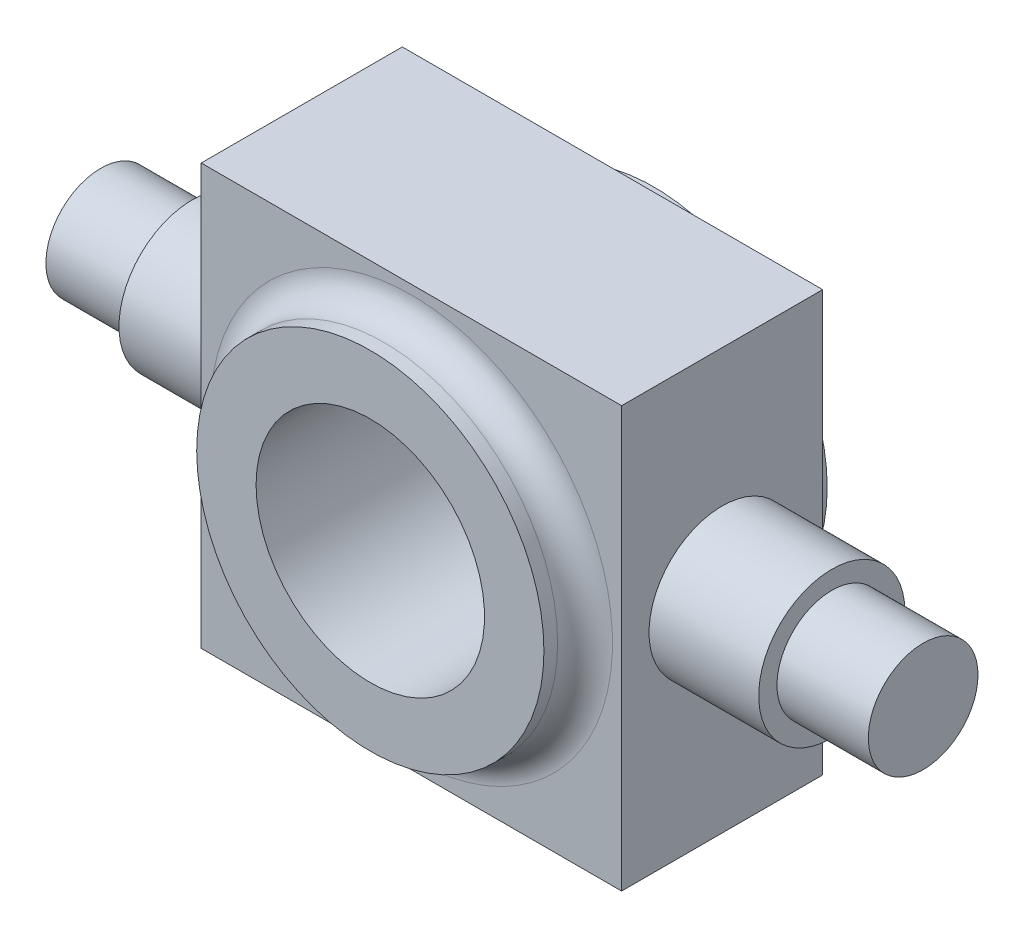
ISO-10303-21;
HEADER;
FILE_DESCRIPTION(('STEP AP214'),'2;1');
FILE_NAME('part.step','',(''),(''),'','','');
FILE_SCHEMA(('AUTOMOTIVE_DESIGN { 1 0 10303 214 1 1 1 1 }'));
ENDSEC;
DATA;
#1=APPLICATION_CONTEXT('core data for automotive mechanical design processes');
#2=APPLICATION_PROTOCOL_DEFINITION('international standard','automotive_design',2000,#1);
#3=PRODUCT_CONTEXT('',#1,'mechanical');
#4=PRODUCT('Part','Part','',(#3));
#5=PRODUCT_RELATED_PRODUCT_CATEGORY('part','',(#4));
#6=PRODUCT_DEFINITION_FORMATION('','',#4);
#7=PRODUCT_DEFINITION_CONTEXT('part definition',#1,'design');
#8=PRODUCT_DEFINITION('design','',#6,#7);
#9=PRODUCT_DEFINITION_SHAPE('','',#8);
#10=(LENGTH_UNIT() NAMED_UNIT(*) SI_UNIT(.MILLI.,.METRE.));
#11=(NAMED_UNIT(*) PLANE_ANGLE_UNIT() SI_UNIT($,.RADIAN.));
#12=(NAMED_UNIT(*) SI_UNIT($,.STERADIAN.) SOLID_ANGLE_UNIT());
#13=UNCERTAINTY_MEASURE_WITH_UNIT(LENGTH_MEASURE(1.E-05),#10,'distance_accuracy_value','');
#14=(GEOMETRIC_REPRESENTATION_CONTEXT(3) GLOBAL_UNCERTAINTY_ASSIGNED_CONTEXT((#13)) GLOBAL_UNIT_ASSIGNED_CONTEXT((#10,
#11,#12)) REPRESENTATION_CONTEXT('',''));
#15=CARTESIAN_POINT('',(0.,0.,0.));
#16=DIRECTION('',(0.,0.,1.));
#17=DIRECTION('',(1.,0.,0.));
#18=AXIS2_PLACEMENT_3D('',#15,#16,#17);
#19=CARTESIAN_POINT('',(0.,0.,15.5));
#20=DIRECTION('',(0.,0.,1.));
#21=DIRECTION('',(1.,0.,0.));
#22=AXIS2_PLACEMENT_3D('',#19,#20,#21);
#23=PLANE('',#22);
#24=CARTESIAN_POINT('',(0.,0.,15.5));
#25=DIRECTION('',(0.,0.,1.));
#26=DIRECTION('',(1.,0.,0.));
#27=AXIS2_PLACEMENT_3D('',#24,#25,#26);
#28=CIRCLE('',#27,19.);
#29=CARTESIAN_POINT('',(19.,0.,15.5));
#30=VERTEX_POINT('',#29);
#31=EDGE_CURVE('E179',#30,#30,#28,.T.);
#32=ORIENTED_EDGE('',*,*,#31,.T.);
#33=EDGE_LOOP('',(#32));
#34=FACE_BOUND('',#33,.T.);
#35=CARTESIAN_POINT('',(0.,0.,15.5));
#36=DIRECTION('',(0.,0.,-1.));
#37=DIRECTION('',(-1.,0.,0.));
#38=AXIS2_PLACEMENT_3D('',#35,#36,#37);
#39=CIRCLE('',#38,12.5);
#40=CARTESIAN_POINT('',(-12.5,0.,15.5));
#41=VERTEX_POINT('',#40);
#42=EDGE_CURVE('E181',#41,#41,#39,.T.);
#43=ORIENTED_EDGE('',*,*,#42,.T.);
#44=EDGE_LOOP('',(#43));
#45=FACE_BOUND('',#44,.T.);
#46=ADVANCED_FACE('F35',(#34,#45),#23,.T.);
#47=CARTESIAN_POINT('',(0.,0.,-15.5));
#48=DIRECTION('',(0.,0.,1.));
#49=DIRECTION('',(1.,0.,0.));
#50=AXIS2_PLACEMENT_3D('',#47,#48,#49);
#51=PLANE('',#50);
#52=CARTESIAN_POINT('',(0.,0.,-15.5));
#53=DIRECTION('',(0.,0.,1.));
#54=DIRECTION('',(1.,0.,0.));
#55=AXIS2_PLACEMENT_3D('',#52,#53,#54);
#56=CIRCLE('',#55,19.);
#57=CARTESIAN_POINT('',(19.,0.,-15.5));
#58=VERTEX_POINT('',#57);
#59=EDGE_CURVE('E106',#58,#58,#56,.T.);
#60=ORIENTED_EDGE('',*,*,#59,.F.);
#61=EDGE_LOOP('',(#60));
#62=FACE_BOUND('',#61,.T.);
#63=CARTESIAN_POINT('',(0.,0.,-15.5));
#64=DIRECTION('',(0.,0.,-1.));
#65=DIRECTION('',(-1.,0.,0.));
#66=AXIS2_PLACEMENT_3D('',#63,#64,#65);
#67=CIRCLE('',#66,16.);
#68=CARTESIAN_POINT('',(-16.,0.,-15.5));
#69=VERTEX_POINT('',#68);
#70=EDGE_CURVE('E190',#69,#69,#67,.T.);
#71=ORIENTED_EDGE('',*,*,#70,.F.);
#72=EDGE_LOOP('',(#71));
#73=FACE_BOUND('',#72,.T.);
#74=ADVANCED_FACE('F132',(#62,#73),#51,.F.);
#75=CARTESIAN_POINT('',(23.,23.,-11.));
#76=DIRECTION('',(-1.,0.,0.));
#77=DIRECTION('',(0.,0.,1.));
#78=AXIS2_PLACEMENT_3D('',#75,#76,#77);
#79=PLANE('',#78);
#80=CARTESIAN_POINT('',(23.,0.,0.));
#81=DIRECTION('',(1.,0.,0.));
#82=DIRECTION('',(0.,0.,-1.));
#83=AXIS2_PLACEMENT_3D('',#80,#81,#82);
#84=CIRCLE('',#83,8.);
#85=CARTESIAN_POINT('',(23.,0.,-8.));
#86=VERTEX_POINT('',#85);
#87=EDGE_CURVE('E174',#86,#86,#84,.T.);
#88=ORIENTED_EDGE('',*,*,#87,.F.);
#89=EDGE_LOOP('',(#88));
#90=FACE_BOUND('',#89,.T.);
#91=DIRECTION('',(0.,0.,-1.));
#92=VECTOR('',#91,1.);
#93=CARTESIAN_POINT('',(23.,-23.,-11.));
#94=LINE('',#93,#92);
#95=CARTESIAN_POINT('',(23.,-23.,11.));
#96=VERTEX_POINT('',#95);
#97=CARTESIAN_POINT('',(23.,-23.,-11.));
#98=VERTEX_POINT('',#97);
#99=EDGE_CURVE('E103',#96,#98,#94,.T.);
#100=ORIENTED_EDGE('',*,*,#99,.T.);
#101=DIRECTION('',(0.,-1.,0.));
#102=VECTOR('',#101,1.);
#103=CARTESIAN_POINT('',(23.,23.,-11.));
#104=LINE('',#103,#102);
#105=CARTESIAN_POINT('',(23.,23.,-11.));
#106=VERTEX_POINT('',#105);
#107=EDGE_CURVE('E94',#106,#98,#104,.T.);
#108=ORIENTED_EDGE('',*,*,#107,.F.);
#109=DIRECTION('',(0.,0.,-1.));
#110=VECTOR('',#109,1.);
#111=CARTESIAN_POINT('',(23.,23.,-11.));
#112=LINE('',#111,#110);
#113=CARTESIAN_POINT('',(23.,23.,11.));
#114=VERTEX_POINT('',#113);
#115=EDGE_CURVE('E88',#114,#106,#112,.T.);
#116=ORIENTED_EDGE('',*,*,#115,.F.);
#117=DIRECTION('',(0.,-1.,0.));
#118=VECTOR('',#117,1.);
#119=CARTESIAN_POINT('',(23.,23.,11.));
#120=LINE('',#119,#118);
#121=EDGE_CURVE('E99',#114,#96,#120,.T.);
#122=ORIENTED_EDGE('',*,*,#121,.T.);
#123=EDGE_LOOP('',(#100,#108,#116,#122));
#124=FACE_BOUND('',#123,.T.);
#125=ADVANCED_FACE('F138',(#90,#124),#79,.F.);
#126=CARTESIAN_POINT('',(-23.,23.,-11.));
#127=DIRECTION('',(0.,0.,1.));
#128=DIRECTION('',(1.,0.,0.));
#129=AXIS2_PLACEMENT_3D('',#126,#127,#128);
#130=PLANE('',#129);
#131=CARTESIAN_POINT('',(0.,0.,-11.));
#132=DIRECTION('',(0.,0.,1.));
#133=DIRECTION('',(1.,0.,0.));
#134=AXIS2_PLACEMENT_3D('',#131,#132,#133);
#135=CIRCLE('',#134,22.);
#136=CARTESIAN_POINT('',(22.,0.,-11.));
#137=VERTEX_POINT('',#136);
#138=EDGE_CURVE('E44',#137,#137,#135,.T.);
#139=ORIENTED_EDGE('',*,*,#138,.T.);
#140=EDGE_LOOP('',(#139));
#141=FACE_BOUND('',#140,.T.);
#142=DIRECTION('',(-1.,0.,0.));
#143=VECTOR('',#142,1.);
#144=CARTESIAN_POINT('',(-23.,-23.,-11.));
#145=LINE('',#144,#143);
#146=CARTESIAN_POINT('',(-23.,-23.,-11.));
#147=VERTEX_POINT('',#146);
#148=EDGE_CURVE('E93',#98,#147,#145,.T.);
#149=ORIENTED_EDGE('',*,*,#148,.T.);
#150=DIRECTION('',(0.,-1.,0.));
#151=VECTOR('',#150,1.);
#152=CARTESIAN_POINT('',(-23.,23.,-11.));
#153=LINE('',#152,#151);
#154=CARTESIAN_POINT('',(-23.,23.,-11.));
#155=VERTEX_POINT('',#154);
#156=EDGE_CURVE('E91',#155,#147,#153,.T.);
#157=ORIENTED_EDGE('',*,*,#156,.F.);
#158=DIRECTION('',(-1.,0.,0.));
#159=VECTOR('',#158,1.);
#160=CARTESIAN_POINT('',(-23.,23.,-11.));
#161=LINE('',#160,#159);
#162=EDGE_CURVE('E83',#106,#155,#161,.T.);
#163=ORIENTED_EDGE('',*,*,#162,.F.);
#164=ORIENTED_EDGE('',*,*,#107,.T.);
#165=EDGE_LOOP('',(#149,#157,#163,#164));
#166=FACE_BOUND('',#165,.T.);
#167=ADVANCED_FACE('F92',(#141,#166),#130,.F.);
#168=CARTESIAN_POINT('',(-23.,23.,-11.));
#169=DIRECTION('',(1.,0.,0.));
#170=DIRECTION('',(0.,0.,-1.));
#171=AXIS2_PLACEMENT_3D('',#168,#169,#170);
#172=PLANE('',#171);
#173=CARTESIAN_POINT('',(-23.,0.,0.));
#174=DIRECTION('',(1.,0.,0.));
#175=DIRECTION('',(0.,0.,-1.));
#176=AXIS2_PLACEMENT_3D('',#173,#174,#175);
#177=CIRCLE('',#176,8.);
#178=CARTESIAN_POINT('',(-23.,0.,-8.));
#179=VERTEX_POINT('',#178);
#180=EDGE_CURVE('E202',#179,#179,#177,.T.);
#181=ORIENTED_EDGE('',*,*,#180,.T.);
#182=EDGE_LOOP('',(#181));
#183=FACE_BOUND('',#182,.T.);
#184=DIRECTION('',(0.,0.,1.));
#185=VECTOR('',#184,1.);
#186=CARTESIAN_POINT('',(-23.,-23.,-11.));
#187=LINE('',#186,#185);
#188=CARTESIAN_POINT('',(-23.,-23.,11.));
#189=VERTEX_POINT('',#188);
#190=EDGE_CURVE('E69',#147,#189,#187,.T.);
#191=ORIENTED_EDGE('',*,*,#190,.T.);
#192=DIRECTION('',(0.,-1.,0.));
#193=VECTOR('',#192,1.);
#194=CARTESIAN_POINT('',(-23.,23.,11.));
#195=LINE('',#194,#193);
#196=CARTESIAN_POINT('',(-23.,23.,11.));
#197=VERTEX_POINT('',#196);
#198=EDGE_CURVE('E95',#197,#189,#195,.T.);
#199=ORIENTED_EDGE('',*,*,#198,.F.);
#200=DIRECTION('',(0.,0.,1.));
#201=VECTOR('',#200,1.);
#202=CARTESIAN_POINT('',(-23.,23.,-11.));
#203=LINE('',#202,#201);
#204=EDGE_CURVE('E86',#155,#197,#203,.T.);
#205=ORIENTED_EDGE('',*,*,#204,.F.);
#206=ORIENTED_EDGE('',*,*,#156,.T.);
#207=EDGE_LOOP('',(#191,#199,#205,#206));
#208=FACE_BOUND('',#207,.T.);
#209=ADVANCED_FACE('F97',(#183,#208),#172,.F.);
#210=CARTESIAN_POINT('',(-23.,23.,11.));
#211=DIRECTION('',(0.,0.,-1.));
#212=DIRECTION('',(-1.,0.,0.));
#213=AXIS2_PLACEMENT_3D('',#210,#211,#212);
#214=PLANE('',#213);
#215=CARTESIAN_POINT('',(0.,0.,11.));
#216=DIRECTION('',(0.,0.,-1.));
#217=DIRECTION('',(-1.,0.,0.));
#218=AXIS2_PLACEMENT_3D('',#215,#216,#217);
#219=CIRCLE('',#218,22.);
#220=CARTESIAN_POINT('',(-22.,0.,11.));
#221=VERTEX_POINT('',#220);
#222=EDGE_CURVE('E113',#221,#221,#219,.T.);
#223=ORIENTED_EDGE('',*,*,#222,.T.);
#224=EDGE_LOOP('',(#223));
#225=FACE_BOUND('',#224,.T.);
#226=DIRECTION('',(1.,0.,0.));
#227=VECTOR('',#226,1.);
#228=CARTESIAN_POINT('',(-23.,-23.,11.));
#229=LINE('',#228,#227);
#230=EDGE_CURVE('E75',#189,#96,#229,.T.);
#231=ORIENTED_EDGE('',*,*,#230,.T.);
#232=ORIENTED_EDGE('',*,*,#121,.F.);
#233=DIRECTION('',(1.,0.,0.));
#234=VECTOR('',#233,1.);
#235=CARTESIAN_POINT('',(-23.,23.,11.));
#236=LINE('',#235,#234);
#237=EDGE_CURVE('E52',#197,#114,#236,.T.);
#238=ORIENTED_EDGE('',*,*,#237,.F.);
#239=ORIENTED_EDGE('',*,*,#198,.T.);
#240=EDGE_LOOP('',(#231,#232,#238,#239));
#241=FACE_BOUND('',#240,.T.);
#242=ADVANCED_FACE('F155',(#225,#241),#214,.F.);
#243=CARTESIAN_POINT('',(0.,23.,0.));
#244=DIRECTION('',(0.,1.,0.));
#245=DIRECTION('',(0.,0.,1.));
#246=AXIS2_PLACEMENT_3D('',#243,#244,#245);
#247=PLANE('',#246);
#248=ORIENTED_EDGE('',*,*,#115,.T.);
#249=ORIENTED_EDGE('',*,*,#162,.T.);
#250=ORIENTED_EDGE('',*,*,#204,.T.);
#251=ORIENTED_EDGE('',*,*,#237,.T.);
#252=EDGE_LOOP('',(#248,#249,#250,#251));
#253=FACE_BOUND('',#252,.T.);
#254=ADVANCED_FACE('F84',(#253),#247,.T.);
#255=CARTESIAN_POINT('',(0.,-23.,0.));
#256=DIRECTION('',(0.,1.,0.));
#257=DIRECTION('',(0.,0.,1.));
#258=AXIS2_PLACEMENT_3D('',#255,#256,#257);
#259=PLANE('',#258);
#260=ORIENTED_EDGE('',*,*,#99,.F.);
#261=ORIENTED_EDGE('',*,*,#230,.F.);
#262=ORIENTED_EDGE('',*,*,#190,.F.);
#263=ORIENTED_EDGE('',*,*,#148,.F.);
#264=EDGE_LOOP('',(#260,#261,#262,#263));
#265=FACE_BOUND('',#264,.T.);
#266=ADVANCED_FACE('F154',(#265),#259,.F.);
#267=CARTESIAN_POINT('',(0.,0.,-15.5));
#268=DIRECTION('',(0.,0.,1.));
#269=DIRECTION('',(1.,0.,0.));
#270=AXIS2_PLACEMENT_3D('',#267,#268,#269);
#271=CYLINDRICAL_SURFACE('',#270,19.);
#272=CARTESIAN_POINT('',(0.,0.,14.));
#273=DIRECTION('',(0.,0.,-1.));
#274=DIRECTION('',(-1.,0.,0.));
#275=AXIS2_PLACEMENT_3D('',#272,#273,#274);
#276=CIRCLE('',#275,19.);
#277=CARTESIAN_POINT('',(-19.,0.,14.));
#278=VERTEX_POINT('',#277);
#279=EDGE_CURVE('E116',#278,#278,#276,.F.);
#280=ORIENTED_EDGE('',*,*,#279,.T.);
#281=EDGE_LOOP('',(#280));
#282=FACE_BOUND('',#281,.T.);
#283=ORIENTED_EDGE('',*,*,#31,.F.);
#284=EDGE_LOOP('',(#283));
#285=FACE_BOUND('',#284,.T.);
#286=ADVANCED_FACE('F150',(#282,#285),#271,.T.);
#287=CARTESIAN_POINT('',(0.,0.,-14.));
#288=DIRECTION('',(0.,0.,1.));
#289=DIRECTION('',(1.,0.,0.));
#290=AXIS2_PLACEMENT_3D('',#287,#288,#289);
#291=CIRCLE('',#290,19.);
#292=CARTESIAN_POINT('',(19.,0.,-14.));
#293=VERTEX_POINT('',#292);
#294=EDGE_CURVE('E11',#293,#293,#291,.F.);
#295=ORIENTED_EDGE('',*,*,#294,.T.);
#296=EDGE_LOOP('',(#295));
#297=FACE_BOUND('',#296,.T.);
#298=ORIENTED_EDGE('',*,*,#59,.T.);
#299=EDGE_LOOP('',(#298));
#300=FACE_BOUND('',#299,.T.);
#301=ADVANCED_FACE('F147',(#297,#300),#271,.T.);
#302=CARTESIAN_POINT('',(0.,0.,-15.5));
#303=DIRECTION('',(0.,0.,-1.));
#304=DIRECTION('',(-1.,0.,0.));
#305=AXIS2_PLACEMENT_3D('',#302,#303,#304);
#306=CYLINDRICAL_SURFACE('',#305,12.5);
#307=CARTESIAN_POINT('',(0.,0.,-12.5));
#308=DIRECTION('',(0.,0.,-1.));
#309=DIRECTION('',(-1.,0.,0.));
#310=AXIS2_PLACEMENT_3D('',#307,#308,#309);
#311=CIRCLE('',#310,12.5);
#312=CARTESIAN_POINT('',(-12.5,0.,-12.5));
#313=VERTEX_POINT('',#312);
#314=EDGE_CURVE('E184',#313,#313,#311,.T.);
#315=ORIENTED_EDGE('',*,*,#314,.T.);
#316=EDGE_LOOP('',(#315));
#317=FACE_BOUND('',#316,.T.);
#318=ORIENTED_EDGE('',*,*,#42,.F.);
#319=EDGE_LOOP('',(#318));
#320=FACE_BOUND('',#319,.T.);
#321=ADVANCED_FACE('F144',(#317,#320),#306,.F.);
#322=CARTESIAN_POINT('',(12.5,0.,-12.5));
#323=DIRECTION('',(0.,0.,-1.));
#324=DIRECTION('',(-1.,0.,0.));
#325=AXIS2_PLACEMENT_3D('',#322,#323,#324);
#326=PLANE('',#325);
#327=CARTESIAN_POINT('',(0.,0.,-12.5));
#328=DIRECTION('',(0.,0.,-1.));
#329=DIRECTION('',(-1.,0.,0.));
#330=AXIS2_PLACEMENT_3D('',#327,#328,#329);
#331=CIRCLE('',#330,16.);
#332=CARTESIAN_POINT('',(-16.,0.,-12.5));
#333=VERTEX_POINT('',#332);
#334=EDGE_CURVE('E187',#333,#333,#331,.T.);
#335=ORIENTED_EDGE('',*,*,#334,.T.);
#336=EDGE_LOOP('',(#335));
#337=FACE_BOUND('',#336,.T.);
#338=ORIENTED_EDGE('',*,*,#314,.F.);
#339=EDGE_LOOP('',(#338));
#340=FACE_BOUND('',#339,.T.);
#341=ADVANCED_FACE('F252',(#337,#340),#326,.T.);
#342=CARTESIAN_POINT('',(0.,0.,-15.5));
#343=DIRECTION('',(0.,0.,-1.));
#344=DIRECTION('',(-1.,0.,0.));
#345=AXIS2_PLACEMENT_3D('',#342,#343,#344);
#346=CYLINDRICAL_SURFACE('',#345,16.);
#347=ORIENTED_EDGE('',*,*,#70,.T.);
#348=EDGE_LOOP('',(#347));
#349=FACE_BOUND('',#348,.T.);
#350=ORIENTED_EDGE('',*,*,#334,.F.);
#351=EDGE_LOOP('',(#350));
#352=FACE_BOUND('',#351,.T.);
#353=ADVANCED_FACE('F249',(#349,#352),#346,.F.);
#354=CARTESIAN_POINT('',(-45.,0.,0.));
#355=DIRECTION('',(-1.,0.,0.));
#356=DIRECTION('',(0.,0.,1.));
#357=AXIS2_PLACEMENT_3D('',#354,#355,#356);
#358=PLANE('',#357);
#359=CARTESIAN_POINT('',(-45.,0.,0.));
#360=DIRECTION('',(1.,0.,0.));
#361=DIRECTION('',(0.,0.,-1.));
#362=AXIS2_PLACEMENT_3D('',#359,#360,#361);
#363=CIRCLE('',#362,6.);
#364=CARTESIAN_POINT('',(-45.,0.,-6.));
#365=VERTEX_POINT('',#364);
#366=EDGE_CURVE('E193',#365,#365,#363,.T.);
#367=ORIENTED_EDGE('',*,*,#366,.F.);
#368=EDGE_LOOP('',(#367));
#369=FACE_BOUND('',#368,.T.);
#370=ADVANCED_FACE('F245',(#369),#358,.T.);
#371=CARTESIAN_POINT('',(-23.,0.,0.));
#372=DIRECTION('',(1.,0.,0.));
#373=DIRECTION('',(0.,0.,-1.));
#374=AXIS2_PLACEMENT_3D('',#371,#372,#373);
#375=CYLINDRICAL_SURFACE('',#374,6.);
#376=ORIENTED_EDGE('',*,*,#366,.T.);
#377=EDGE_LOOP('',(#376));
#378=FACE_BOUND('',#377,.T.);
#379=CARTESIAN_POINT('',(-35.,0.,0.));
#380=DIRECTION('',(1.,0.,0.));
#381=DIRECTION('',(0.,0.,-1.));
#382=AXIS2_PLACEMENT_3D('',#379,#380,#381);
#383=CIRCLE('',#382,6.);
#384=CARTESIAN_POINT('',(-35.,0.,-6.));
#385=VERTEX_POINT('',#384);
#386=EDGE_CURVE('E196',#385,#385,#383,.T.);
#387=ORIENTED_EDGE('',*,*,#386,.F.);
#388=EDGE_LOOP('',(#387));
#389=FACE_BOUND('',#388,.T.);
#390=ADVANCED_FACE('F241',(#378,#389),#375,.T.);
#391=CARTESIAN_POINT('',(-35.,0.,-6.));
#392=DIRECTION('',(-1.,0.,0.));
#393=DIRECTION('',(0.,0.,1.));
#394=AXIS2_PLACEMENT_3D('',#391,#392,#393);
#395=PLANE('',#394);
#396=ORIENTED_EDGE('',*,*,#386,.T.);
#397=EDGE_LOOP('',(#396));
#398=FACE_BOUND('',#397,.T.);
#399=CARTESIAN_POINT('',(-35.,0.,0.));
#400=DIRECTION('',(1.,0.,0.));
#401=DIRECTION('',(0.,0.,-1.));
#402=AXIS2_PLACEMENT_3D('',#399,#400,#401);
#403=CIRCLE('',#402,8.);
#404=CARTESIAN_POINT('',(-35.,0.,-8.));
#405=VERTEX_POINT('',#404);
#406=EDGE_CURVE('E199',#405,#405,#403,.T.);
#407=ORIENTED_EDGE('',*,*,#406,.F.);
#408=EDGE_LOOP('',(#407));
#409=FACE_BOUND('',#408,.T.);
#410=ADVANCED_FACE('F237',(#398,#409),#395,.T.);
#411=CARTESIAN_POINT('',(-23.,0.,0.));
#412=DIRECTION('',(1.,0.,0.));
#413=DIRECTION('',(0.,0.,-1.));
#414=AXIS2_PLACEMENT_3D('',#411,#412,#413);
#415=CYLINDRICAL_SURFACE('',#414,8.);
#416=ORIENTED_EDGE('',*,*,#406,.T.);
#417=EDGE_LOOP('',(#416));
#418=FACE_BOUND('',#417,.T.);
#419=ORIENTED_EDGE('',*,*,#180,.F.);
#420=EDGE_LOOP('',(#419));
#421=FACE_BOUND('',#420,.T.);
#422=ADVANCED_FACE('F233',(#418,#421),#415,.T.);
#423=CARTESIAN_POINT('',(45.,0.,0.));
#424=DIRECTION('',(1.,0.,0.));
#425=DIRECTION('',(0.,0.,1.));
#426=AXIS2_PLACEMENT_3D('',#423,#424,#425);
#427=PLANE('',#426);
#428=CARTESIAN_POINT('',(45.,0.,0.));
#429=DIRECTION('',(1.,0.,0.));
#430=DIRECTION('',(0.,0.,-1.));
#431=AXIS2_PLACEMENT_3D('',#428,#429,#430);
#432=CIRCLE('',#431,6.);
#433=CARTESIAN_POINT('',(45.,0.,-6.));
#434=VERTEX_POINT('',#433);
#435=EDGE_CURVE('E205',#434,#434,#432,.T.);
#436=ORIENTED_EDGE('',*,*,#435,.T.);
#437=EDGE_LOOP('',(#436));
#438=FACE_BOUND('',#437,.T.);
#439=ADVANCED_FACE('F229',(#438),#427,.T.);
#440=CARTESIAN_POINT('',(23.,0.,0.));
#441=DIRECTION('',(-1.,0.,0.));
#442=DIRECTION('',(0.,0.,-1.));
#443=AXIS2_PLACEMENT_3D('',#440,#441,#442);
#444=CYLINDRICAL_SURFACE('',#443,6.);
#445=ORIENTED_EDGE('',*,*,#435,.F.);
#446=EDGE_LOOP('',(#445));
#447=FACE_BOUND('',#446,.T.);
#448=CARTESIAN_POINT('',(35.,0.,0.));
#449=DIRECTION('',(1.,0.,0.));
#450=DIRECTION('',(0.,0.,-1.));
#451=AXIS2_PLACEMENT_3D('',#448,#449,#450);
#452=CIRCLE('',#451,6.);
#453=CARTESIAN_POINT('',(35.,0.,-6.));
#454=VERTEX_POINT('',#453);
#455=EDGE_CURVE('E208',#454,#454,#452,.T.);
#456=ORIENTED_EDGE('',*,*,#455,.T.);
#457=EDGE_LOOP('',(#456));
#458=FACE_BOUND('',#457,.T.);
#459=ADVANCED_FACE('F222',(#447,#458),#444,.T.);
#460=CARTESIAN_POINT('',(35.,0.,-6.));
#461=DIRECTION('',(1.,0.,0.));
#462=DIRECTION('',(0.,0.,1.));
#463=AXIS2_PLACEMENT_3D('',#460,#461,#462);
#464=PLANE('',#463);
#465=ORIENTED_EDGE('',*,*,#455,.F.);
#466=EDGE_LOOP('',(#465));
#467=FACE_BOUND('',#466,.T.);
#468=CARTESIAN_POINT('',(35.,0.,0.));
#469=DIRECTION('',(1.,0.,0.));
#470=DIRECTION('',(0.,0.,-1.));
#471=AXIS2_PLACEMENT_3D('',#468,#469,#470);
#472=CIRCLE('',#471,8.);
#473=CARTESIAN_POINT('',(35.,0.,-8.));
#474=VERTEX_POINT('',#473);
#475=EDGE_CURVE('E211',#474,#474,#472,.T.);
#476=ORIENTED_EDGE('',*,*,#475,.T.);
#477=EDGE_LOOP('',(#476));
#478=FACE_BOUND('',#477,.T.);
#479=ADVANCED_FACE('F216',(#467,#478),#464,.T.);
#480=CARTESIAN_POINT('',(23.,0.,0.));
#481=DIRECTION('',(-1.,0.,0.));
#482=DIRECTION('',(0.,0.,-1.));
#483=AXIS2_PLACEMENT_3D('',#480,#481,#482);
#484=CYLINDRICAL_SURFACE('',#483,8.);
#485=ORIENTED_EDGE('',*,*,#475,.F.);
#486=EDGE_LOOP('',(#485));
#487=FACE_BOUND('',#486,.T.);
#488=ORIENTED_EDGE('',*,*,#87,.T.);
#489=EDGE_LOOP('',(#488));
#490=FACE_BOUND('',#489,.T.);
#491=ADVANCED_FACE('F128',(#487,#490),#484,.T.);
#492=CARTESIAN_POINT('',(0.,0.,14.));
#493=DIRECTION('',(0.,0.,-1.));
#494=DIRECTION('',(-1.,0.,0.));
#495=AXIS2_PLACEMENT_3D('',#492,#493,#494);
#496=TOROIDAL_SURFACE('',#495,22.,3.);
#497=ORIENTED_EDGE('',*,*,#279,.F.);
#498=EDGE_LOOP('',(#497));
#499=FACE_BOUND('',#498,.T.);
#500=ORIENTED_EDGE('',*,*,#222,.F.);
#501=EDGE_LOOP('',(#500));
#502=FACE_BOUND('',#501,.T.);
#503=ADVANCED_FACE('F123',(#499,#502),#496,.F.);
#504=CARTESIAN_POINT('',(0.,0.,-14.));
#505=DIRECTION('',(0.,0.,1.));
#506=DIRECTION('',(1.,0.,0.));
#507=AXIS2_PLACEMENT_3D('',#504,#505,#506);
#508=TOROIDAL_SURFACE('',#507,22.,3.);
#509=ORIENTED_EDGE('',*,*,#294,.F.);
#510=EDGE_LOOP('',(#509));
#511=FACE_BOUND('',#510,.T.);
#512=ORIENTED_EDGE('',*,*,#138,.F.);
#513=EDGE_LOOP('',(#512));
#514=FACE_BOUND('',#513,.T.);
#515=ADVANCED_FACE('F37',(#511,#514),#508,.F.);
#516=CLOSED_SHELL('',(#46,#74,#125,#167,#209,#242,#254,#266,#286,#301,#321,#341,#353,#370,#390,
#410,#422,#439,#459,#479,#491,#503,#515));
#517=MANIFOLD_SOLID_BREP('B2',#516);
#518=ADVANCED_BREP_SHAPE_REPRESENTATION('',(#18,#517),#14);
#519=SHAPE_DEFINITION_REPRESENTATION(#9,#518);
ENDSEC;
END-ISO-10303-21;
